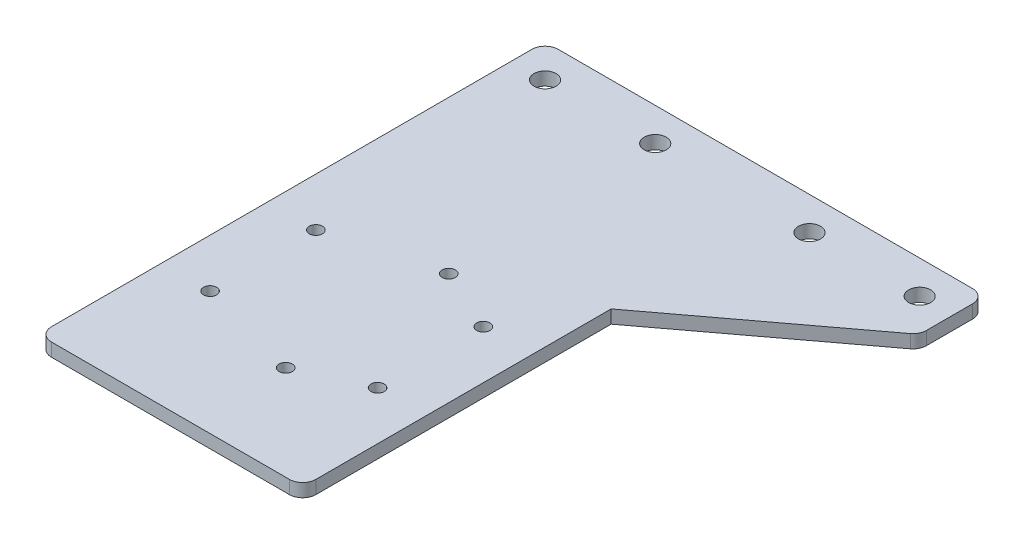
ISO-10303-21;
HEADER;
FILE_DESCRIPTION(('STEP AP214'),'2;1');
FILE_NAME('part.step','',(''),(''),'','','');
FILE_SCHEMA(('AUTOMOTIVE_DESIGN { 1 0 10303 214 1 1 1 1 }'));
ENDSEC;
DATA;
#1=APPLICATION_CONTEXT('core data for automotive mechanical design processes');
#2=APPLICATION_PROTOCOL_DEFINITION('international standard','automotive_design',2000,#1);
#3=PRODUCT_CONTEXT('',#1,'mechanical');
#4=PRODUCT('Part','Part','',(#3));
#5=PRODUCT_RELATED_PRODUCT_CATEGORY('part','',(#4));
#6=PRODUCT_DEFINITION_FORMATION('','',#4);
#7=PRODUCT_DEFINITION_CONTEXT('part definition',#1,'design');
#8=PRODUCT_DEFINITION('design','',#6,#7);
#9=PRODUCT_DEFINITION_SHAPE('','',#8);
#10=(LENGTH_UNIT() NAMED_UNIT(*) SI_UNIT(.MILLI.,.METRE.));
#11=(NAMED_UNIT(*) PLANE_ANGLE_UNIT() SI_UNIT($,.RADIAN.));
#12=(NAMED_UNIT(*) SI_UNIT($,.STERADIAN.) SOLID_ANGLE_UNIT());
#13=UNCERTAINTY_MEASURE_WITH_UNIT(LENGTH_MEASURE(1.E-05),#10,'distance_accuracy_value','');
#14=(GEOMETRIC_REPRESENTATION_CONTEXT(3) GLOBAL_UNCERTAINTY_ASSIGNED_CONTEXT((#13)) GLOBAL_UNIT_ASSIGNED_CONTEXT((#10,
#11,#12)) REPRESENTATION_CONTEXT('',''));
#15=CARTESIAN_POINT('',(0.,0.,0.));
#16=DIRECTION('',(0.,0.,1.));
#17=DIRECTION('',(1.,0.,0.));
#18=AXIS2_PLACEMENT_3D('',#15,#16,#17);
#19=CARTESIAN_POINT('',(0.,0.,0.));
#20=DIRECTION('',(0.,1.,0.));
#21=DIRECTION('',(0.,0.,1.));
#22=AXIS2_PLACEMENT_3D('',#19,#20,#21);
#23=PLANE('',#22);
#24=CARTESIAN_POINT('',(-47.,0.,62.));
#25=DIRECTION('',(0.,1.,0.));
#26=DIRECTION('',(0.,0.,1.));
#27=AXIS2_PLACEMENT_3D('',#24,#25,#26);
#28=CIRCLE('',#27,3.);
#29=CARTESIAN_POINT('',(-50.,0.,62.));
#30=VERTEX_POINT('',#29);
#31=CARTESIAN_POINT('',(-47.,0.,65.));
#32=VERTEX_POINT('',#31);
#33=EDGE_CURVE('E20',#30,#32,#28,.T.);
#34=ORIENTED_EDGE('',*,*,#33,.F.);
#35=DIRECTION('',(0.,0.,-1.));
#36=VECTOR('',#35,1.);
#37=CARTESIAN_POINT('',(-50.,0.,-50.));
#38=LINE('',#37,#36);
#39=CARTESIAN_POINT('',(-50.,0.,-47.));
#40=VERTEX_POINT('',#39);
#41=EDGE_CURVE('E94',#30,#40,#38,.T.);
#42=ORIENTED_EDGE('',*,*,#41,.T.);
#43=CARTESIAN_POINT('',(-47.,0.,-47.));
#44=DIRECTION('',(0.,-1.,0.));
#45=DIRECTION('',(0.,0.,-1.));
#46=AXIS2_PLACEMENT_3D('',#43,#44,#45);
#47=CIRCLE('',#46,3.);
#48=CARTESIAN_POINT('',(-47.,0.,-50.));
#49=VERTEX_POINT('',#48);
#50=EDGE_CURVE('E222',#49,#40,#47,.F.);
#51=ORIENTED_EDGE('',*,*,#50,.F.);
#52=DIRECTION('',(1.,0.,0.));
#53=VECTOR('',#52,1.);
#54=CARTESIAN_POINT('',(-50.,0.,-50.));
#55=LINE('',#54,#53);
#56=CARTESIAN_POINT('',(47.,0.,-50.));
#57=VERTEX_POINT('',#56);
#58=EDGE_CURVE('E126',#49,#57,#55,.T.);
#59=ORIENTED_EDGE('',*,*,#58,.T.);
#60=CARTESIAN_POINT('',(47.,0.,-47.));
#61=DIRECTION('',(0.,-1.,0.));
#62=DIRECTION('',(0.,0.,-1.));
#63=AXIS2_PLACEMENT_3D('',#60,#61,#62);
#64=CIRCLE('',#63,3.);
#65=CARTESIAN_POINT('',(50.,0.,-47.));
#66=VERTEX_POINT('',#65);
#67=EDGE_CURVE('E129',#66,#57,#64,.F.);
#68=ORIENTED_EDGE('',*,*,#67,.F.);
#69=DIRECTION('',(0.,0.,1.));
#70=VECTOR('',#69,1.);
#71=CARTESIAN_POINT('',(50.,0.,-50.));
#72=LINE('',#71,#70);
#73=CARTESIAN_POINT('',(50.,0.,-36.5));
#74=VERTEX_POINT('',#73);
#75=EDGE_CURVE('E130',#66,#74,#72,.T.);
#76=ORIENTED_EDGE('',*,*,#75,.T.);
#77=CARTESIAN_POINT('',(47.,0.,-36.5));
#78=DIRECTION('',(0.,1.,0.));
#79=DIRECTION('',(0.,0.,1.));
#80=AXIS2_PLACEMENT_3D('',#77,#78,#79);
#81=CIRCLE('',#80,3.);
#82=CARTESIAN_POINT('',(48.8,0.,-34.1));
#83=VERTEX_POINT('',#82);
#84=EDGE_CURVE('E137',#83,#74,#81,.T.);
#85=ORIENTED_EDGE('',*,*,#84,.F.);
#86=DIRECTION('',(-0.8,0.,0.6));
#87=VECTOR('',#86,1.);
#88=CARTESIAN_POINT('',(10.,0.,-5.));
#89=LINE('',#88,#87);
#90=CARTESIAN_POINT('',(10.,0.,-5.));
#91=VERTEX_POINT('',#90);
#92=EDGE_CURVE('E134',#83,#91,#89,.T.);
#93=ORIENTED_EDGE('',*,*,#92,.T.);
#94=DIRECTION('',(0.,0.,1.));
#95=VECTOR('',#94,1.);
#96=CARTESIAN_POINT('',(10.,0.,65.));
#97=LINE('',#96,#95);
#98=CARTESIAN_POINT('',(10.,0.,62.));
#99=VERTEX_POINT('',#98);
#100=EDGE_CURVE('E141',#91,#99,#97,.T.);
#101=ORIENTED_EDGE('',*,*,#100,.T.);
#102=CARTESIAN_POINT('',(7.,0.,62.));
#103=DIRECTION('',(0.,1.,0.));
#104=DIRECTION('',(0.,0.,1.));
#105=AXIS2_PLACEMENT_3D('',#102,#103,#104);
#106=CIRCLE('',#105,3.);
#107=CARTESIAN_POINT('',(7.,0.,65.));
#108=VERTEX_POINT('',#107);
#109=EDGE_CURVE('E111',#108,#99,#106,.T.);
#110=ORIENTED_EDGE('',*,*,#109,.F.);
#111=DIRECTION('',(1.,0.,0.));
#112=VECTOR('',#111,1.);
#113=CARTESIAN_POINT('',(0.,0.,65.));
#114=LINE('',#113,#112);
#115=EDGE_CURVE('E108',#32,#108,#114,.T.);
#116=ORIENTED_EDGE('',*,*,#115,.F.);
#117=EDGE_LOOP('',(#34,#42,#51,#59,#68,#76,#85,#93,#101,#110,#116));
#118=FACE_BOUND('',#117,.T.);
#119=CARTESIAN_POINT('',(-42.5,0.,-42.5));
#120=DIRECTION('',(0.,1.,0.));
#121=DIRECTION('',(0.,0.,1.));
#122=AXIS2_PLACEMENT_3D('',#119,#120,#121);
#123=CIRCLE('',#122,2.5);
#124=CARTESIAN_POINT('',(-42.5,0.,-40.));
#125=VERTEX_POINT('',#124);
#126=EDGE_CURVE('E191',#125,#125,#123,.T.);
#127=ORIENTED_EDGE('',*,*,#126,.T.);
#128=EDGE_LOOP('',(#127));
#129=FACE_BOUND('',#128,.T.);
#130=CARTESIAN_POINT('',(42.5,0.,-42.5));
#131=DIRECTION('',(0.,1.,0.));
#132=DIRECTION('',(0.,0.,1.));
#133=AXIS2_PLACEMENT_3D('',#130,#131,#132);
#134=CIRCLE('',#133,2.5);
#135=CARTESIAN_POINT('',(42.5,0.,-40.));
#136=VERTEX_POINT('',#135);
#137=EDGE_CURVE('E194',#136,#136,#134,.T.);
#138=ORIENTED_EDGE('',*,*,#137,.T.);
#139=EDGE_LOOP('',(#138));
#140=FACE_BOUND('',#139,.T.);
#141=CARTESIAN_POINT('',(17.5,0.,-42.5));
#142=DIRECTION('',(0.,1.,0.));
#143=DIRECTION('',(0.,0.,1.));
#144=AXIS2_PLACEMENT_3D('',#141,#142,#143);
#145=CIRCLE('',#144,2.5);
#146=CARTESIAN_POINT('',(17.5,0.,-40.));
#147=VERTEX_POINT('',#146);
#148=EDGE_CURVE('E197',#147,#147,#145,.T.);
#149=ORIENTED_EDGE('',*,*,#148,.T.);
#150=EDGE_LOOP('',(#149));
#151=FACE_BOUND('',#150,.T.);
#152=CARTESIAN_POINT('',(-17.5,0.,-42.5));
#153=DIRECTION('',(0.,1.,0.));
#154=DIRECTION('',(0.,0.,1.));
#155=AXIS2_PLACEMENT_3D('',#152,#153,#154);
#156=CIRCLE('',#155,2.5);
#157=CARTESIAN_POINT('',(-17.5,0.,-40.));
#158=VERTEX_POINT('',#157);
#159=EDGE_CURVE('E200',#158,#158,#156,.T.);
#160=ORIENTED_EDGE('',*,*,#159,.T.);
#161=EDGE_LOOP('',(#160));
#162=FACE_BOUND('',#161,.T.);
#163=CARTESIAN_POINT('',(-39.,0.,13.));
#164=DIRECTION('',(0.,1.,0.));
#165=DIRECTION('',(0.,0.,1.));
#166=AXIS2_PLACEMENT_3D('',#163,#164,#165);
#167=CIRCLE('',#166,1.5);
#168=CARTESIAN_POINT('',(-39.,0.,14.5));
#169=VERTEX_POINT('',#168);
#170=EDGE_CURVE('E203',#169,#169,#167,.T.);
#171=ORIENTED_EDGE('',*,*,#170,.T.);
#172=EDGE_LOOP('',(#171));
#173=FACE_BOUND('',#172,.T.);
#174=CARTESIAN_POINT('',(-39.,0.,37.));
#175=DIRECTION('',(0.,1.,0.));
#176=DIRECTION('',(0.,0.,1.));
#177=AXIS2_PLACEMENT_3D('',#174,#175,#176);
#178=CIRCLE('',#177,1.5);
#179=CARTESIAN_POINT('',(-39.,0.,38.5));
#180=VERTEX_POINT('',#179);
#181=EDGE_CURVE('E206',#180,#180,#178,.T.);
#182=ORIENTED_EDGE('',*,*,#181,.T.);
#183=EDGE_LOOP('',(#182));
#184=FACE_BOUND('',#183,.T.);
#185=CARTESIAN_POINT('',(-1.,0.,37.));
#186=DIRECTION('',(0.,1.,0.));
#187=DIRECTION('',(0.,0.,1.));
#188=AXIS2_PLACEMENT_3D('',#185,#186,#187);
#189=CIRCLE('',#188,1.5);
#190=CARTESIAN_POINT('',(-1.,0.,38.5));
#191=VERTEX_POINT('',#190);
#192=EDGE_CURVE('E209',#191,#191,#189,.T.);
#193=ORIENTED_EDGE('',*,*,#192,.T.);
#194=EDGE_LOOP('',(#193));
#195=FACE_BOUND('',#194,.T.);
#196=CARTESIAN_POINT('',(-1.,0.,13.));
#197=DIRECTION('',(0.,1.,0.));
#198=DIRECTION('',(0.,0.,1.));
#199=AXIS2_PLACEMENT_3D('',#196,#197,#198);
#200=CIRCLE('',#199,1.5);
#201=CARTESIAN_POINT('',(-1.,0.,14.5));
#202=VERTEX_POINT('',#201);
#203=EDGE_CURVE('E212',#202,#202,#200,.T.);
#204=ORIENTED_EDGE('',*,*,#203,.T.);
#205=EDGE_LOOP('',(#204));
#206=FACE_BOUND('',#205,.T.);
#207=CARTESIAN_POINT('',(-15.3499999999994,0.,6.49999999971643));
#208=DIRECTION('',(0.,-1.,0.));
#209=DIRECTION('',(0.,0.,-1.));
#210=AXIS2_PLACEMENT_3D('',#207,#208,#209);
#211=CIRCLE('',#210,1.50000000008189);
#212=CARTESIAN_POINT('',(-15.3499999999994,0.,4.99999999963454));
#213=VERTEX_POINT('',#212);
#214=EDGE_CURVE('E215',#213,#213,#211,.F.);
#215=ORIENTED_EDGE('',*,*,#214,.T.);
#216=EDGE_LOOP('',(#215));
#217=FACE_BOUND('',#216,.T.);
#218=CARTESIAN_POINT('',(-15.35,0.,43.4999999999878));
#219=DIRECTION('',(0.,1.,0.));
#220=DIRECTION('',(0.,0.,1.));
#221=AXIS2_PLACEMENT_3D('',#218,#219,#220);
#222=CIRCLE('',#221,1.49999999999595);
#223=CARTESIAN_POINT('',(-15.35,0.,44.9999999999837));
#224=VERTEX_POINT('',#223);
#225=EDGE_CURVE('E218',#224,#224,#222,.T.);
#226=ORIENTED_EDGE('',*,*,#225,.T.);
#227=EDGE_LOOP('',(#226));
#228=FACE_BOUND('',#227,.T.);
#229=ADVANCED_FACE('F17',(#118,#129,#140,#151,#162,#173,#184,#195,#206,#217,#228),#23,.F.);
#230=CARTESIAN_POINT('',(-50.,3.,-50.));
#231=DIRECTION('',(1.,0.,0.));
#232=DIRECTION('',(0.,0.,-1.));
#233=AXIS2_PLACEMENT_3D('',#230,#231,#232);
#234=PLANE('',#233);
#235=DIRECTION('',(0.,1.,0.));
#236=VECTOR('',#235,1.);
#237=CARTESIAN_POINT('',(-50.,0.,62.));
#238=LINE('',#237,#236);
#239=CARTESIAN_POINT('',(-50.,3.,62.));
#240=VERTEX_POINT('',#239);
#241=EDGE_CURVE('E105',#240,#30,#238,.F.);
#242=ORIENTED_EDGE('',*,*,#241,.F.);
#243=DIRECTION('',(0.,0.,1.));
#244=VECTOR('',#243,1.);
#245=CARTESIAN_POINT('',(-50.,3.,0.));
#246=LINE('',#245,#244);
#247=CARTESIAN_POINT('',(-50.,3.,-47.));
#248=VERTEX_POINT('',#247);
#249=EDGE_CURVE('E190',#248,#240,#246,.T.);
#250=ORIENTED_EDGE('',*,*,#249,.F.);
#251=DIRECTION('',(0.,-1.,0.));
#252=VECTOR('',#251,1.);
#253=CARTESIAN_POINT('',(-50.,3.,-47.));
#254=LINE('',#253,#252);
#255=EDGE_CURVE('E221',#40,#248,#254,.F.);
#256=ORIENTED_EDGE('',*,*,#255,.F.);
#257=ORIENTED_EDGE('',*,*,#41,.F.);
#258=EDGE_LOOP('',(#242,#250,#256,#257));
#259=FACE_BOUND('',#258,.T.);
#260=ADVANCED_FACE('F282',(#259),#234,.F.);
#261=CARTESIAN_POINT('',(-47.,0.,62.));
#262=DIRECTION('',(0.,1.,0.));
#263=DIRECTION('',(0.,0.,1.));
#264=AXIS2_PLACEMENT_3D('',#261,#262,#263);
#265=CYLINDRICAL_SURFACE('',#264,3.);
#266=ORIENTED_EDGE('',*,*,#33,.T.);
#267=DIRECTION('',(0.,1.,0.));
#268=VECTOR('',#267,1.);
#269=CARTESIAN_POINT('',(-47.,0.,65.));
#270=LINE('',#269,#268);
#271=CARTESIAN_POINT('',(-47.,3.,65.));
#272=VERTEX_POINT('',#271);
#273=EDGE_CURVE('E103',#272,#32,#270,.F.);
#274=ORIENTED_EDGE('',*,*,#273,.F.);
#275=CARTESIAN_POINT('',(-47.,3.,62.));
#276=DIRECTION('',(0.,1.,0.));
#277=DIRECTION('',(0.,0.,1.));
#278=AXIS2_PLACEMENT_3D('',#275,#276,#277);
#279=CIRCLE('',#278,3.);
#280=EDGE_CURVE('E188',#240,#272,#279,.T.);
#281=ORIENTED_EDGE('',*,*,#280,.F.);
#282=ORIENTED_EDGE('',*,*,#241,.T.);
#283=EDGE_LOOP('',(#266,#274,#281,#282));
#284=FACE_BOUND('',#283,.T.);
#285=ADVANCED_FACE('F100',(#284),#265,.T.);
#286=CARTESIAN_POINT('',(0.,0.,65.));
#287=DIRECTION('',(0.,0.,1.));
#288=DIRECTION('',(1.,0.,0.));
#289=AXIS2_PLACEMENT_3D('',#286,#287,#288);
#290=PLANE('',#289);
#291=ORIENTED_EDGE('',*,*,#115,.T.);
#292=DIRECTION('',(0.,1.,0.));
#293=VECTOR('',#292,1.);
#294=CARTESIAN_POINT('',(7.,-7.,65.));
#295=LINE('',#294,#293);
#296=CARTESIAN_POINT('',(7.,3.,65.));
#297=VERTEX_POINT('',#296);
#298=EDGE_CURVE('E114',#297,#108,#295,.F.);
#299=ORIENTED_EDGE('',*,*,#298,.F.);
#300=DIRECTION('',(1.,0.,0.));
#301=VECTOR('',#300,1.);
#302=CARTESIAN_POINT('',(0.,3.,65.));
#303=LINE('',#302,#301);
#304=EDGE_CURVE('E118',#272,#297,#303,.T.);
#305=ORIENTED_EDGE('',*,*,#304,.F.);
#306=ORIENTED_EDGE('',*,*,#273,.T.);
#307=EDGE_LOOP('',(#291,#299,#305,#306));
#308=FACE_BOUND('',#307,.T.);
#309=ADVANCED_FACE('F116',(#308),#290,.T.);
#310=CARTESIAN_POINT('',(7.,-7.,62.));
#311=DIRECTION('',(0.,1.,0.));
#312=DIRECTION('',(0.,0.,1.));
#313=AXIS2_PLACEMENT_3D('',#310,#311,#312);
#314=CYLINDRICAL_SURFACE('',#313,3.);
#315=ORIENTED_EDGE('',*,*,#109,.T.);
#316=DIRECTION('',(0.,1.,0.));
#317=VECTOR('',#316,1.);
#318=CARTESIAN_POINT('',(10.,-7.,62.));
#319=LINE('',#318,#317);
#320=CARTESIAN_POINT('',(10.,3.,62.));
#321=VERTEX_POINT('',#320);
#322=EDGE_CURVE('E143',#99,#321,#319,.T.);
#323=ORIENTED_EDGE('',*,*,#322,.T.);
#324=CARTESIAN_POINT('',(7.,3.,62.));
#325=DIRECTION('',(0.,1.,0.));
#326=DIRECTION('',(0.,0.,1.));
#327=AXIS2_PLACEMENT_3D('',#324,#325,#326);
#328=CIRCLE('',#327,3.);
#329=EDGE_CURVE('E184',#297,#321,#328,.T.);
#330=ORIENTED_EDGE('',*,*,#329,.F.);
#331=ORIENTED_EDGE('',*,*,#298,.T.);
#332=EDGE_LOOP('',(#315,#323,#330,#331));
#333=FACE_BOUND('',#332,.T.);
#334=ADVANCED_FACE('F232',(#333),#314,.T.);
#335=CARTESIAN_POINT('',(10.,-7.,65.));
#336=DIRECTION('',(-1.,0.,0.));
#337=DIRECTION('',(0.,0.,1.));
#338=AXIS2_PLACEMENT_3D('',#335,#336,#337);
#339=PLANE('',#338);
#340=ORIENTED_EDGE('',*,*,#322,.F.);
#341=ORIENTED_EDGE('',*,*,#100,.F.);
#342=DIRECTION('',(0.,1.,0.));
#343=VECTOR('',#342,1.);
#344=CARTESIAN_POINT('',(10.,-7.,-5.));
#345=LINE('',#344,#343);
#346=CARTESIAN_POINT('',(10.,3.,-5.));
#347=VERTEX_POINT('',#346);
#348=EDGE_CURVE('E138',#91,#347,#345,.T.);
#349=ORIENTED_EDGE('',*,*,#348,.T.);
#350=DIRECTION('',(0.,0.,1.));
#351=VECTOR('',#350,1.);
#352=CARTESIAN_POINT('',(10.,3.,0.));
#353=LINE('',#352,#351);
#354=EDGE_CURVE('E187',#321,#347,#353,.F.);
#355=ORIENTED_EDGE('',*,*,#354,.F.);
#356=EDGE_LOOP('',(#340,#341,#349,#355));
#357=FACE_BOUND('',#356,.T.);
#358=ADVANCED_FACE('F261',(#357),#339,.F.);
#359=CARTESIAN_POINT('',(10.,-7.,-5.));
#360=DIRECTION('',(-0.6,0.,-0.8));
#361=DIRECTION('',(-0.8,0.,0.6));
#362=AXIS2_PLACEMENT_3D('',#359,#360,#361);
#363=PLANE('',#362);
#364=DIRECTION('',(0.,1.,0.));
#365=VECTOR('',#364,1.);
#366=CARTESIAN_POINT('',(48.8,-7.,-34.1));
#367=LINE('',#366,#365);
#368=CARTESIAN_POINT('',(48.8,3.,-34.1));
#369=VERTEX_POINT('',#368);
#370=EDGE_CURVE('E133',#369,#83,#367,.F.);
#371=ORIENTED_EDGE('',*,*,#370,.F.);
#372=DIRECTION('',(0.8,0.,-0.6));
#373=VECTOR('',#372,1.);
#374=CARTESIAN_POINT('',(10.,3.,-5.));
#375=LINE('',#374,#373);
#376=EDGE_CURVE('E183',#347,#369,#375,.T.);
#377=ORIENTED_EDGE('',*,*,#376,.F.);
#378=ORIENTED_EDGE('',*,*,#348,.F.);
#379=ORIENTED_EDGE('',*,*,#92,.F.);
#380=EDGE_LOOP('',(#371,#377,#378,#379));
#381=FACE_BOUND('',#380,.T.);
#382=ADVANCED_FACE('F265',(#381),#363,.F.);
#383=CARTESIAN_POINT('',(47.,-7.,-36.5));
#384=DIRECTION('',(0.,1.,0.));
#385=DIRECTION('',(0.,0.,1.));
#386=AXIS2_PLACEMENT_3D('',#383,#384,#385);
#387=CYLINDRICAL_SURFACE('',#386,3.);
#388=CARTESIAN_POINT('',(47.,3.,-36.5));
#389=DIRECTION('',(0.,1.,0.));
#390=DIRECTION('',(0.,0.,1.));
#391=AXIS2_PLACEMENT_3D('',#388,#389,#390);
#392=CIRCLE('',#391,3.);
#393=CARTESIAN_POINT('',(50.,3.,-36.5));
#394=VERTEX_POINT('',#393);
#395=EDGE_CURVE('E180',#369,#394,#392,.T.);
#396=ORIENTED_EDGE('',*,*,#395,.F.);
#397=ORIENTED_EDGE('',*,*,#370,.T.);
#398=ORIENTED_EDGE('',*,*,#84,.T.);
#399=DIRECTION('',(0.,1.,0.));
#400=VECTOR('',#399,1.);
#401=CARTESIAN_POINT('',(50.,3.,-36.5));
#402=LINE('',#401,#400);
#403=EDGE_CURVE('E132',#74,#394,#402,.T.);
#404=ORIENTED_EDGE('',*,*,#403,.T.);
#405=EDGE_LOOP('',(#396,#397,#398,#404));
#406=FACE_BOUND('',#405,.T.);
#407=ADVANCED_FACE('F346',(#406),#387,.T.);
#408=CARTESIAN_POINT('',(50.,3.,-50.));
#409=DIRECTION('',(-1.,0.,0.));
#410=DIRECTION('',(0.,0.,1.));
#411=AXIS2_PLACEMENT_3D('',#408,#409,#410);
#412=PLANE('',#411);
#413=ORIENTED_EDGE('',*,*,#403,.F.);
#414=ORIENTED_EDGE('',*,*,#75,.F.);
#415=DIRECTION('',(0.,-1.,0.));
#416=VECTOR('',#415,1.);
#417=CARTESIAN_POINT('',(50.,3.,-47.));
#418=LINE('',#417,#416);
#419=CARTESIAN_POINT('',(50.,3.,-47.));
#420=VERTEX_POINT('',#419);
#421=EDGE_CURVE('E227',#420,#66,#418,.T.);
#422=ORIENTED_EDGE('',*,*,#421,.F.);
#423=DIRECTION('',(0.,0.,1.));
#424=VECTOR('',#423,1.);
#425=CARTESIAN_POINT('',(50.,3.,0.));
#426=LINE('',#425,#424);
#427=EDGE_CURVE('E179',#394,#420,#426,.F.);
#428=ORIENTED_EDGE('',*,*,#427,.F.);
#429=EDGE_LOOP('',(#413,#414,#422,#428));
#430=FACE_BOUND('',#429,.T.);
#431=ADVANCED_FACE('F343',(#430),#412,.F.);
#432=CARTESIAN_POINT('',(47.,3.,-47.));
#433=DIRECTION('',(0.,-1.,0.));
#434=DIRECTION('',(0.,0.,-1.));
#435=AXIS2_PLACEMENT_3D('',#432,#433,#434);
#436=CYLINDRICAL_SURFACE('',#435,3.);
#437=ORIENTED_EDGE('',*,*,#67,.T.);
#438=DIRECTION('',(0.,1.,0.));
#439=VECTOR('',#438,1.);
#440=CARTESIAN_POINT('',(47.,3.,-50.));
#441=LINE('',#440,#439);
#442=CARTESIAN_POINT('',(47.,3.,-50.));
#443=VERTEX_POINT('',#442);
#444=EDGE_CURVE('E128',#57,#443,#441,.T.);
#445=ORIENTED_EDGE('',*,*,#444,.T.);
#446=CARTESIAN_POINT('',(47.,3.,-47.));
#447=DIRECTION('',(0.,-1.,0.));
#448=DIRECTION('',(0.,0.,-1.));
#449=AXIS2_PLACEMENT_3D('',#446,#447,#448);
#450=CIRCLE('',#449,3.);
#451=EDGE_CURVE('E176',#420,#443,#450,.F.);
#452=ORIENTED_EDGE('',*,*,#451,.F.);
#453=ORIENTED_EDGE('',*,*,#421,.T.);
#454=EDGE_LOOP('',(#437,#445,#452,#453));
#455=FACE_BOUND('',#454,.T.);
#456=ADVANCED_FACE('F278',(#455),#436,.T.);
#457=CARTESIAN_POINT('',(-50.,3.,-50.));
#458=DIRECTION('',(0.,0.,1.));
#459=DIRECTION('',(1.,0.,0.));
#460=AXIS2_PLACEMENT_3D('',#457,#458,#459);
#461=PLANE('',#460);
#462=ORIENTED_EDGE('',*,*,#444,.F.);
#463=ORIENTED_EDGE('',*,*,#58,.F.);
#464=DIRECTION('',(0.,-1.,0.));
#465=VECTOR('',#464,1.);
#466=CARTESIAN_POINT('',(-47.,3.,-50.));
#467=LINE('',#466,#465);
#468=CARTESIAN_POINT('',(-47.,3.,-50.));
#469=VERTEX_POINT('',#468);
#470=EDGE_CURVE('E35',#469,#49,#467,.T.);
#471=ORIENTED_EDGE('',*,*,#470,.F.);
#472=DIRECTION('',(1.,0.,0.));
#473=VECTOR('',#472,1.);
#474=CARTESIAN_POINT('',(0.,3.,-50.));
#475=LINE('',#474,#473);
#476=EDGE_CURVE('E175',#443,#469,#475,.F.);
#477=ORIENTED_EDGE('',*,*,#476,.F.);
#478=EDGE_LOOP('',(#462,#463,#471,#477));
#479=FACE_BOUND('',#478,.T.);
#480=ADVANCED_FACE('F275',(#479),#461,.F.);
#481=CARTESIAN_POINT('',(-47.,3.,-47.));
#482=DIRECTION('',(0.,-1.,0.));
#483=DIRECTION('',(0.,0.,-1.));
#484=AXIS2_PLACEMENT_3D('',#481,#482,#483);
#485=CYLINDRICAL_SURFACE('',#484,3.);
#486=ORIENTED_EDGE('',*,*,#50,.T.);
#487=ORIENTED_EDGE('',*,*,#255,.T.);
#488=CARTESIAN_POINT('',(-47.,3.,-47.));
#489=DIRECTION('',(0.,-1.,0.));
#490=DIRECTION('',(0.,0.,-1.));
#491=AXIS2_PLACEMENT_3D('',#488,#489,#490);
#492=CIRCLE('',#491,3.);
#493=EDGE_CURVE('E172',#469,#248,#492,.F.);
#494=ORIENTED_EDGE('',*,*,#493,.F.);
#495=ORIENTED_EDGE('',*,*,#470,.T.);
#496=EDGE_LOOP('',(#486,#487,#494,#495));
#497=FACE_BOUND('',#496,.T.);
#498=ADVANCED_FACE('F281',(#497),#485,.T.);
#499=CARTESIAN_POINT('',(-15.35,-7.,43.4999999999878));
#500=DIRECTION('',(0.,1.,0.));
#501=DIRECTION('',(0.,0.,1.));
#502=AXIS2_PLACEMENT_3D('',#499,#500,#501);
#503=CYLINDRICAL_SURFACE('',#502,1.49999999999595);
#504=CARTESIAN_POINT('',(-15.35,3.,43.4999999999878));
#505=DIRECTION('',(0.,1.,0.));
#506=DIRECTION('',(0.,0.,1.));
#507=AXIS2_PLACEMENT_3D('',#504,#505,#506);
#508=CIRCLE('',#507,1.49999999999595);
#509=CARTESIAN_POINT('',(-15.35,3.,44.9999999999837));
#510=VERTEX_POINT('',#509);
#511=EDGE_CURVE('E169',#510,#510,#508,.F.);
#512=ORIENTED_EDGE('',*,*,#511,.F.);
#513=EDGE_LOOP('',(#512));
#514=FACE_BOUND('',#513,.T.);
#515=ORIENTED_EDGE('',*,*,#225,.F.);
#516=EDGE_LOOP('',(#515));
#517=FACE_BOUND('',#516,.T.);
#518=ADVANCED_FACE('F332',(#514,#517),#503,.F.);
#519=CARTESIAN_POINT('',(-15.3499999999994,10.,6.49999999971643));
#520=DIRECTION('',(0.,-1.,0.));
#521=DIRECTION('',(0.,0.,-1.));
#522=AXIS2_PLACEMENT_3D('',#519,#520,#521);
#523=CYLINDRICAL_SURFACE('',#522,1.50000000008189);
#524=CARTESIAN_POINT('',(-15.3499999999994,3.,6.49999999971643));
#525=DIRECTION('',(0.,-1.,0.));
#526=DIRECTION('',(0.,0.,-1.));
#527=AXIS2_PLACEMENT_3D('',#524,#525,#526);
#528=CIRCLE('',#527,1.50000000008189);
#529=CARTESIAN_POINT('',(-15.3499999999994,3.,4.99999999963454));
#530=VERTEX_POINT('',#529);
#531=EDGE_CURVE('E166',#530,#530,#528,.T.);
#532=ORIENTED_EDGE('',*,*,#531,.F.);
#533=EDGE_LOOP('',(#532));
#534=FACE_BOUND('',#533,.T.);
#535=ORIENTED_EDGE('',*,*,#214,.F.);
#536=EDGE_LOOP('',(#535));
#537=FACE_BOUND('',#536,.T.);
#538=ADVANCED_FACE('F328',(#534,#537),#523,.F.);
#539=CARTESIAN_POINT('',(-1.,0.,13.));
#540=DIRECTION('',(0.,1.,0.));
#541=DIRECTION('',(0.,0.,1.));
#542=AXIS2_PLACEMENT_3D('',#539,#540,#541);
#543=CYLINDRICAL_SURFACE('',#542,1.5);
#544=CARTESIAN_POINT('',(-1.,3.,13.));
#545=DIRECTION('',(0.,1.,0.));
#546=DIRECTION('',(0.,0.,1.));
#547=AXIS2_PLACEMENT_3D('',#544,#545,#546);
#548=CIRCLE('',#547,1.5);
#549=CARTESIAN_POINT('',(-1.,3.,14.5));
#550=VERTEX_POINT('',#549);
#551=EDGE_CURVE('E163',#550,#550,#548,.F.);
#552=ORIENTED_EDGE('',*,*,#551,.F.);
#553=EDGE_LOOP('',(#552));
#554=FACE_BOUND('',#553,.T.);
#555=ORIENTED_EDGE('',*,*,#203,.F.);
#556=EDGE_LOOP('',(#555));
#557=FACE_BOUND('',#556,.T.);
#558=ADVANCED_FACE('F324',(#554,#557),#543,.F.);
#559=CARTESIAN_POINT('',(-1.,0.,37.));
#560=DIRECTION('',(0.,1.,0.));
#561=DIRECTION('',(0.,0.,1.));
#562=AXIS2_PLACEMENT_3D('',#559,#560,#561);
#563=CYLINDRICAL_SURFACE('',#562,1.5);
#564=CARTESIAN_POINT('',(-1.,3.,37.));
#565=DIRECTION('',(0.,1.,0.));
#566=DIRECTION('',(0.,0.,1.));
#567=AXIS2_PLACEMENT_3D('',#564,#565,#566);
#568=CIRCLE('',#567,1.5);
#569=CARTESIAN_POINT('',(-1.,3.,38.5));
#570=VERTEX_POINT('',#569);
#571=EDGE_CURVE('E160',#570,#570,#568,.F.);
#572=ORIENTED_EDGE('',*,*,#571,.F.);
#573=EDGE_LOOP('',(#572));
#574=FACE_BOUND('',#573,.T.);
#575=ORIENTED_EDGE('',*,*,#192,.F.);
#576=EDGE_LOOP('',(#575));
#577=FACE_BOUND('',#576,.T.);
#578=ADVANCED_FACE('F320',(#574,#577),#563,.F.);
#579=CARTESIAN_POINT('',(-39.,0.,37.));
#580=DIRECTION('',(0.,1.,0.));
#581=DIRECTION('',(0.,0.,1.));
#582=AXIS2_PLACEMENT_3D('',#579,#580,#581);
#583=CYLINDRICAL_SURFACE('',#582,1.5);
#584=CARTESIAN_POINT('',(-39.,3.,37.));
#585=DIRECTION('',(0.,1.,0.));
#586=DIRECTION('',(0.,0.,1.));
#587=AXIS2_PLACEMENT_3D('',#584,#585,#586);
#588=CIRCLE('',#587,1.5);
#589=CARTESIAN_POINT('',(-39.,3.,38.5));
#590=VERTEX_POINT('',#589);
#591=EDGE_CURVE('E157',#590,#590,#588,.F.);
#592=ORIENTED_EDGE('',*,*,#591,.F.);
#593=EDGE_LOOP('',(#592));
#594=FACE_BOUND('',#593,.T.);
#595=ORIENTED_EDGE('',*,*,#181,.F.);
#596=EDGE_LOOP('',(#595));
#597=FACE_BOUND('',#596,.T.);
#598=ADVANCED_FACE('F316',(#594,#597),#583,.F.);
#599=CARTESIAN_POINT('',(-39.,0.,13.));
#600=DIRECTION('',(0.,1.,0.));
#601=DIRECTION('',(0.,0.,1.));
#602=AXIS2_PLACEMENT_3D('',#599,#600,#601);
#603=CYLINDRICAL_SURFACE('',#602,1.5);
#604=CARTESIAN_POINT('',(-39.,3.,13.));
#605=DIRECTION('',(0.,1.,0.));
#606=DIRECTION('',(0.,0.,1.));
#607=AXIS2_PLACEMENT_3D('',#604,#605,#606);
#608=CIRCLE('',#607,1.5);
#609=CARTESIAN_POINT('',(-39.,3.,14.5));
#610=VERTEX_POINT('',#609);
#611=EDGE_CURVE('E154',#610,#610,#608,.F.);
#612=ORIENTED_EDGE('',*,*,#611,.F.);
#613=EDGE_LOOP('',(#612));
#614=FACE_BOUND('',#613,.T.);
#615=ORIENTED_EDGE('',*,*,#170,.F.);
#616=EDGE_LOOP('',(#615));
#617=FACE_BOUND('',#616,.T.);
#618=ADVANCED_FACE('F312',(#614,#617),#603,.F.);
#619=CARTESIAN_POINT('',(-17.5,0.,-42.5));
#620=DIRECTION('',(0.,1.,0.));
#621=DIRECTION('',(0.,0.,1.));
#622=AXIS2_PLACEMENT_3D('',#619,#620,#621);
#623=CYLINDRICAL_SURFACE('',#622,2.5);
#624=CARTESIAN_POINT('',(-17.5,3.,-42.5));
#625=DIRECTION('',(0.,1.,0.));
#626=DIRECTION('',(0.,0.,1.));
#627=AXIS2_PLACEMENT_3D('',#624,#625,#626);
#628=CIRCLE('',#627,2.5);
#629=CARTESIAN_POINT('',(-17.5,3.,-40.));
#630=VERTEX_POINT('',#629);
#631=EDGE_CURVE('E151',#630,#630,#628,.F.);
#632=ORIENTED_EDGE('',*,*,#631,.F.);
#633=EDGE_LOOP('',(#632));
#634=FACE_BOUND('',#633,.T.);
#635=ORIENTED_EDGE('',*,*,#159,.F.);
#636=EDGE_LOOP('',(#635));
#637=FACE_BOUND('',#636,.T.);
#638=ADVANCED_FACE('F308',(#634,#637),#623,.F.);
#639=CARTESIAN_POINT('',(17.5,0.,-42.5));
#640=DIRECTION('',(0.,1.,0.));
#641=DIRECTION('',(0.,0.,1.));
#642=AXIS2_PLACEMENT_3D('',#639,#640,#641);
#643=CYLINDRICAL_SURFACE('',#642,2.5);
#644=CARTESIAN_POINT('',(17.5,3.,-42.5));
#645=DIRECTION('',(0.,1.,0.));
#646=DIRECTION('',(0.,0.,1.));
#647=AXIS2_PLACEMENT_3D('',#644,#645,#646);
#648=CIRCLE('',#647,2.5);
#649=CARTESIAN_POINT('',(17.5,3.,-40.));
#650=VERTEX_POINT('',#649);
#651=EDGE_CURVE('E148',#650,#650,#648,.F.);
#652=ORIENTED_EDGE('',*,*,#651,.F.);
#653=EDGE_LOOP('',(#652));
#654=FACE_BOUND('',#653,.T.);
#655=ORIENTED_EDGE('',*,*,#148,.F.);
#656=EDGE_LOOP('',(#655));
#657=FACE_BOUND('',#656,.T.);
#658=ADVANCED_FACE('F304',(#654,#657),#643,.F.);
#659=CARTESIAN_POINT('',(42.5,0.,-42.5));
#660=DIRECTION('',(0.,1.,0.));
#661=DIRECTION('',(0.,0.,1.));
#662=AXIS2_PLACEMENT_3D('',#659,#660,#661);
#663=CYLINDRICAL_SURFACE('',#662,2.5);
#664=CARTESIAN_POINT('',(42.5,3.,-42.5));
#665=DIRECTION('',(0.,1.,0.));
#666=DIRECTION('',(0.,0.,1.));
#667=AXIS2_PLACEMENT_3D('',#664,#665,#666);
#668=CIRCLE('',#667,2.5);
#669=CARTESIAN_POINT('',(42.5,3.,-40.));
#670=VERTEX_POINT('',#669);
#671=EDGE_CURVE('E26',#670,#670,#668,.F.);
#672=ORIENTED_EDGE('',*,*,#671,.F.);
#673=EDGE_LOOP('',(#672));
#674=FACE_BOUND('',#673,.T.);
#675=ORIENTED_EDGE('',*,*,#137,.F.);
#676=EDGE_LOOP('',(#675));
#677=FACE_BOUND('',#676,.T.);
#678=ADVANCED_FACE('F297',(#674,#677),#663,.F.);
#679=CARTESIAN_POINT('',(-42.5,0.,-42.5));
#680=DIRECTION('',(0.,1.,0.));
#681=DIRECTION('',(0.,0.,1.));
#682=AXIS2_PLACEMENT_3D('',#679,#680,#681);
#683=CYLINDRICAL_SURFACE('',#682,2.5);
#684=CARTESIAN_POINT('',(-42.5,3.,-42.5));
#685=DIRECTION('',(0.,1.,0.));
#686=DIRECTION('',(0.,0.,1.));
#687=AXIS2_PLACEMENT_3D('',#684,#685,#686);
#688=CIRCLE('',#687,2.5);
#689=CARTESIAN_POINT('',(-42.5,3.,-40.));
#690=VERTEX_POINT('',#689);
#691=EDGE_CURVE('E11',#690,#690,#688,.F.);
#692=ORIENTED_EDGE('',*,*,#691,.F.);
#693=EDGE_LOOP('',(#692));
#694=FACE_BOUND('',#693,.T.);
#695=ORIENTED_EDGE('',*,*,#126,.F.);
#696=EDGE_LOOP('',(#695));
#697=FACE_BOUND('',#696,.T.);
#698=ADVANCED_FACE('F291',(#694,#697),#683,.F.);
#699=CARTESIAN_POINT('',(0.,3.,0.));
#700=DIRECTION('',(0.,1.,0.));
#701=DIRECTION('',(0.,0.,1.));
#702=AXIS2_PLACEMENT_3D('',#699,#700,#701);
#703=PLANE('',#702);
#704=ORIENTED_EDGE('',*,*,#691,.T.);
#705=EDGE_LOOP('',(#704));
#706=FACE_BOUND('',#705,.T.);
#707=ORIENTED_EDGE('',*,*,#671,.T.);
#708=EDGE_LOOP('',(#707));
#709=FACE_BOUND('',#708,.T.);
#710=ORIENTED_EDGE('',*,*,#651,.T.);
#711=EDGE_LOOP('',(#710));
#712=FACE_BOUND('',#711,.T.);
#713=ORIENTED_EDGE('',*,*,#631,.T.);
#714=EDGE_LOOP('',(#713));
#715=FACE_BOUND('',#714,.T.);
#716=ORIENTED_EDGE('',*,*,#611,.T.);
#717=EDGE_LOOP('',(#716));
#718=FACE_BOUND('',#717,.T.);
#719=ORIENTED_EDGE('',*,*,#591,.T.);
#720=EDGE_LOOP('',(#719));
#721=FACE_BOUND('',#720,.T.);
#722=ORIENTED_EDGE('',*,*,#571,.T.);
#723=EDGE_LOOP('',(#722));
#724=FACE_BOUND('',#723,.T.);
#725=ORIENTED_EDGE('',*,*,#551,.T.);
#726=EDGE_LOOP('',(#725));
#727=FACE_BOUND('',#726,.T.);
#728=ORIENTED_EDGE('',*,*,#531,.T.);
#729=EDGE_LOOP('',(#728));
#730=FACE_BOUND('',#729,.T.);
#731=ORIENTED_EDGE('',*,*,#511,.T.);
#732=EDGE_LOOP('',(#731));
#733=FACE_BOUND('',#732,.T.);
#734=ORIENTED_EDGE('',*,*,#476,.T.);
#735=ORIENTED_EDGE('',*,*,#493,.T.);
#736=ORIENTED_EDGE('',*,*,#249,.T.);
#737=ORIENTED_EDGE('',*,*,#280,.T.);
#738=ORIENTED_EDGE('',*,*,#304,.T.);
#739=ORIENTED_EDGE('',*,*,#329,.T.);
#740=ORIENTED_EDGE('',*,*,#354,.T.);
#741=ORIENTED_EDGE('',*,*,#376,.T.);
#742=ORIENTED_EDGE('',*,*,#395,.T.);
#743=ORIENTED_EDGE('',*,*,#427,.T.);
#744=ORIENTED_EDGE('',*,*,#451,.T.);
#745=EDGE_LOOP('',(#734,#735,#736,#737,#738,#739,#740,#741,#742,#743,#744));
#746=FACE_BOUND('',#745,.T.);
#747=ADVANCED_FACE('F237',(#706,#709,#712,#715,#718,#721,#724,#727,#730,#733,#746),#703,.T.);
#748=CLOSED_SHELL('',(#229,#260,#285,#309,#334,#358,#382,#407,#431,#456,#480,#498,#518,#538,
#558,#578,#598,#618,#638,#658,#678,#698,#747));
#749=MANIFOLD_SOLID_BREP('B1',#748);
#750=ADVANCED_BREP_SHAPE_REPRESENTATION('',(#18,#749),#14);
#751=SHAPE_DEFINITION_REPRESENTATION(#9,#750);
ENDSEC;
END-ISO-10303-21;
